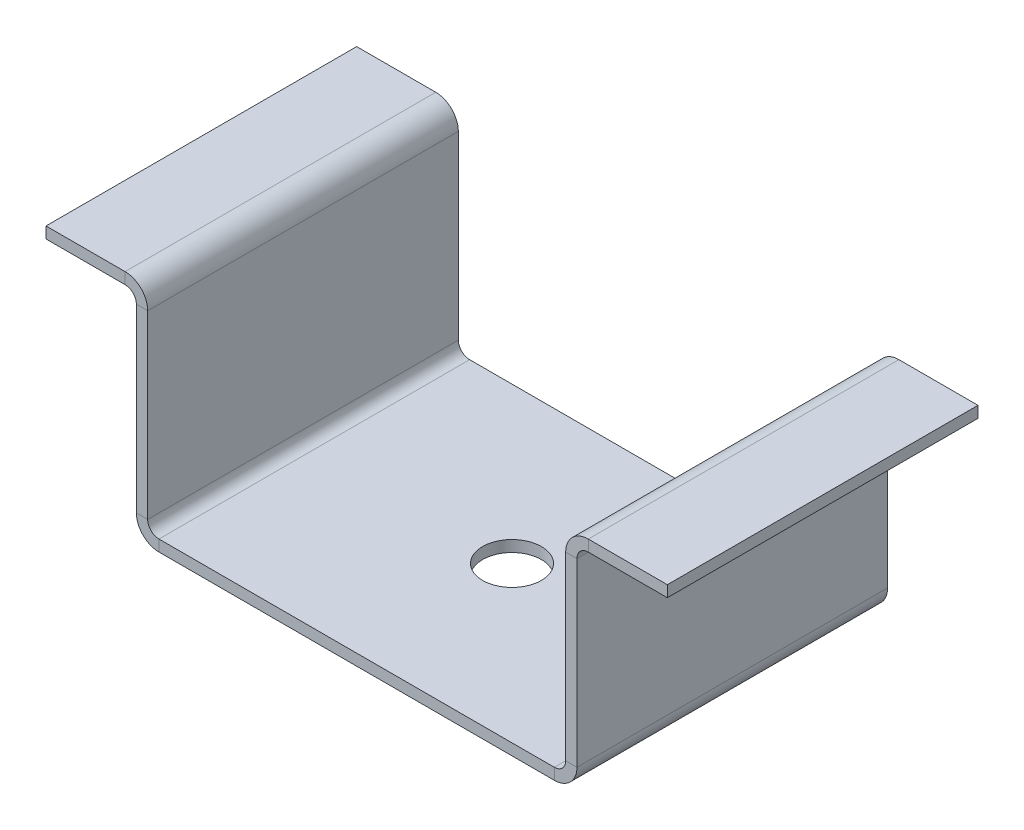
ISO-10303-21;
HEADER;
FILE_DESCRIPTION(('STEP AP214'),'2;1');
FILE_NAME('part.step','',(''),(''),'','','');
FILE_SCHEMA(('AUTOMOTIVE_DESIGN { 1 0 10303 214 1 1 1 1 }'));
ENDSEC;
DATA;
#1=APPLICATION_CONTEXT('core data for automotive mechanical design processes');
#2=APPLICATION_PROTOCOL_DEFINITION('international standard','automotive_design',2000,#1);
#3=PRODUCT_CONTEXT('',#1,'mechanical');
#4=PRODUCT('Part','Part','',(#3));
#5=PRODUCT_RELATED_PRODUCT_CATEGORY('part','',(#4));
#6=PRODUCT_DEFINITION_FORMATION('','',#4);
#7=PRODUCT_DEFINITION_CONTEXT('part definition',#1,'design');
#8=PRODUCT_DEFINITION('design','',#6,#7);
#9=PRODUCT_DEFINITION_SHAPE('','',#8);
#10=(LENGTH_UNIT() NAMED_UNIT(*) SI_UNIT(.MILLI.,.METRE.));
#11=(NAMED_UNIT(*) PLANE_ANGLE_UNIT() SI_UNIT($,.RADIAN.));
#12=(NAMED_UNIT(*) SI_UNIT($,.STERADIAN.) SOLID_ANGLE_UNIT());
#13=UNCERTAINTY_MEASURE_WITH_UNIT(LENGTH_MEASURE(1.E-05),#10,'distance_accuracy_value','');
#14=(GEOMETRIC_REPRESENTATION_CONTEXT(3) GLOBAL_UNCERTAINTY_ASSIGNED_CONTEXT((#13)) GLOBAL_UNIT_ASSIGNED_CONTEXT((#10,
#11,#12)) REPRESENTATION_CONTEXT('',''));
#15=CARTESIAN_POINT('',(0.,0.,0.));
#16=DIRECTION('',(0.,0.,1.));
#17=DIRECTION('',(1.,0.,0.));
#18=AXIS2_PLACEMENT_3D('',#15,#16,#17);
#19=CARTESIAN_POINT('',(-39.0000000000001,40.,27.5));
#20=DIRECTION('',(0.,0.,-1.));
#21=DIRECTION('',(-1.,0.,0.));
#22=AXIS2_PLACEMENT_3D('',#19,#20,#21);
#23=PLANE('',#22);
#24=DIRECTION('',(1.,0.,0.));
#25=VECTOR('',#24,1.);
#26=CARTESIAN_POINT('',(-39.0000000000001,36.,27.5));
#27=LINE('',#26,#25);
#28=CARTESIAN_POINT('',(-39.0000000000001,36.,27.5));
#29=VERTEX_POINT('',#28);
#30=CARTESIAN_POINT('',(-37.0000000000001,36.,27.5));
#31=VERTEX_POINT('',#30);
#32=EDGE_CURVE('E321',#29,#31,#27,.T.);
#33=ORIENTED_EDGE('',*,*,#32,.F.);
#34=DIRECTION('',(0.,1.,0.));
#35=VECTOR('',#34,1.);
#36=CARTESIAN_POINT('',(-39.,-1.42291393803877E-13,27.5));
#37=LINE('',#36,#35);
#38=CARTESIAN_POINT('',(-39.,3.99999999999999,27.5));
#39=VERTEX_POINT('',#38);
#40=EDGE_CURVE('E423',#39,#29,#37,.T.);
#41=ORIENTED_EDGE('',*,*,#40,.F.);
#42=DIRECTION('',(1.,0.,0.));
#43=VECTOR('',#42,1.);
#44=CARTESIAN_POINT('',(-37.,4.,27.5));
#45=LINE('',#44,#43);
#46=CARTESIAN_POINT('',(-37.,4.,27.5));
#47=VERTEX_POINT('',#46);
#48=EDGE_CURVE('E434',#47,#39,#45,.F.);
#49=ORIENTED_EDGE('',*,*,#48,.F.);
#50=DIRECTION('',(0.,-1.,0.));
#51=VECTOR('',#50,1.);
#52=CARTESIAN_POINT('',(-37.0000000000001,40.,27.5));
#53=LINE('',#52,#51);
#54=EDGE_CURVE('E428',#47,#31,#53,.F.);
#55=ORIENTED_EDGE('',*,*,#54,.T.);
#56=EDGE_LOOP('',(#33,#41,#49,#55));
#57=FACE_BOUND('',#56,.T.);
#58=ADVANCED_FACE('F124',(#57),#23,.F.);
#59=CARTESIAN_POINT('',(-39.,1.99999999999999,-27.5));
#60=DIRECTION('',(0.,0.,1.));
#61=DIRECTION('',(1.,0.,0.));
#62=AXIS2_PLACEMENT_3D('',#59,#60,#61);
#63=PLANE('',#62);
#64=DIRECTION('',(1.,0.,0.));
#65=VECTOR('',#64,1.);
#66=CARTESIAN_POINT('',(-39.0000000000001,36.,-27.5));
#67=LINE('',#66,#65);
#68=CARTESIAN_POINT('',(-39.0000000000001,36.,-27.5));
#69=VERTEX_POINT('',#68);
#70=CARTESIAN_POINT('',(-37.0000000000001,36.,-27.5));
#71=VERTEX_POINT('',#70);
#72=EDGE_CURVE('E310',#69,#71,#67,.T.);
#73=ORIENTED_EDGE('',*,*,#72,.T.);
#74=DIRECTION('',(0.,1.,0.));
#75=VECTOR('',#74,1.);
#76=CARTESIAN_POINT('',(-37.,2.,-27.5));
#77=LINE('',#76,#75);
#78=CARTESIAN_POINT('',(-37.,4.,-27.5));
#79=VERTEX_POINT('',#78);
#80=EDGE_CURVE('E426',#71,#79,#77,.F.);
#81=ORIENTED_EDGE('',*,*,#80,.T.);
#82=DIRECTION('',(1.,0.,0.));
#83=VECTOR('',#82,1.);
#84=CARTESIAN_POINT('',(-39.,3.99999999999999,-27.5));
#85=LINE('',#84,#83);
#86=CARTESIAN_POINT('',(-39.,3.99999999999999,-27.5));
#87=VERTEX_POINT('',#86);
#88=EDGE_CURVE('E417',#79,#87,#85,.F.);
#89=ORIENTED_EDGE('',*,*,#88,.T.);
#90=DIRECTION('',(0.,-1.,0.));
#91=VECTOR('',#90,1.);
#92=CARTESIAN_POINT('',(-39.,-1.42291393803877E-13,-27.5));
#93=LINE('',#92,#91);
#94=EDGE_CURVE('E420',#69,#87,#93,.T.);
#95=ORIENTED_EDGE('',*,*,#94,.F.);
#96=EDGE_LOOP('',(#73,#81,#89,#95));
#97=FACE_BOUND('',#96,.T.);
#98=ADVANCED_FACE('F544',(#97),#63,.F.);
#99=CARTESIAN_POINT('',(-39.,-1.42291393803877E-13,0.));
#100=DIRECTION('',(1.,0.,0.));
#101=DIRECTION('',(0.,1.,0.));
#102=AXIS2_PLACEMENT_3D('',#99,#100,#101);
#103=PLANE('',#102);
#104=DIRECTION('',(0.,0.,-1.));
#105=VECTOR('',#104,1.);
#106=CARTESIAN_POINT('',(-39.0000000000001,36.,-27.5));
#107=LINE('',#106,#105);
#108=EDGE_CURVE('E316',#69,#29,#107,.F.);
#109=ORIENTED_EDGE('',*,*,#108,.F.);
#110=ORIENTED_EDGE('',*,*,#94,.T.);
#111=DIRECTION('',(0.,0.,1.));
#112=VECTOR('',#111,1.);
#113=CARTESIAN_POINT('',(-39.,3.99999999999999,-27.5));
#114=LINE('',#113,#112);
#115=EDGE_CURVE('E431',#39,#87,#114,.F.);
#116=ORIENTED_EDGE('',*,*,#115,.F.);
#117=ORIENTED_EDGE('',*,*,#40,.T.);
#118=EDGE_LOOP('',(#109,#110,#116,#117));
#119=FACE_BOUND('',#118,.T.);
#120=ADVANCED_FACE('F550',(#119),#103,.F.);
#121=CARTESIAN_POINT('',(-37.,-1.35308431126191E-13,0.));
#122=DIRECTION('',(1.,0.,0.));
#123=DIRECTION('',(0.,1.,0.));
#124=AXIS2_PLACEMENT_3D('',#121,#122,#123);
#125=PLANE('',#124);
#126=ORIENTED_EDGE('',*,*,#80,.F.);
#127=DIRECTION('',(0.,0.,-1.));
#128=VECTOR('',#127,1.);
#129=CARTESIAN_POINT('',(-37.0000000000001,36.,-27.5));
#130=LINE('',#129,#128);
#131=EDGE_CURVE('E305',#71,#31,#130,.F.);
#132=ORIENTED_EDGE('',*,*,#131,.T.);
#133=ORIENTED_EDGE('',*,*,#54,.F.);
#134=DIRECTION('',(0.,0.,1.));
#135=VECTOR('',#134,1.);
#136=CARTESIAN_POINT('',(-37.,4.,-27.5));
#137=LINE('',#136,#135);
#138=EDGE_CURVE('E437',#79,#47,#137,.T.);
#139=ORIENTED_EDGE('',*,*,#138,.F.);
#140=EDGE_LOOP('',(#126,#132,#133,#139));
#141=FACE_BOUND('',#140,.T.);
#142=ADVANCED_FACE('F598',(#141),#125,.T.);
#143=CARTESIAN_POINT('',(39.,1.99999999999999,27.5));
#144=DIRECTION('',(0.,0.,-1.));
#145=DIRECTION('',(-1.,0.,0.));
#146=AXIS2_PLACEMENT_3D('',#143,#144,#145);
#147=PLANE('',#146);
#148=DIRECTION('',(-1.,0.,0.));
#149=VECTOR('',#148,1.);
#150=CARTESIAN_POINT('',(39.0000000000001,36.,27.5));
#151=LINE('',#150,#149);
#152=CARTESIAN_POINT('',(39.0000000000001,36.,27.5));
#153=VERTEX_POINT('',#152);
#154=CARTESIAN_POINT('',(37.0000000000001,36.,27.5));
#155=VERTEX_POINT('',#154);
#156=EDGE_CURVE('E361',#153,#155,#151,.T.);
#157=ORIENTED_EDGE('',*,*,#156,.T.);
#158=DIRECTION('',(0.,1.,0.));
#159=VECTOR('',#158,1.);
#160=CARTESIAN_POINT('',(37.,2.,27.5));
#161=LINE('',#160,#159);
#162=CARTESIAN_POINT('',(37.,4.,27.5));
#163=VERTEX_POINT('',#162);
#164=EDGE_CURVE('E385',#155,#163,#161,.F.);
#165=ORIENTED_EDGE('',*,*,#164,.T.);
#166=DIRECTION('',(-1.,0.,0.));
#167=VECTOR('',#166,1.);
#168=CARTESIAN_POINT('',(39.,3.99999999999999,27.5));
#169=LINE('',#168,#167);
#170=CARTESIAN_POINT('',(39.,3.99999999999999,27.5));
#171=VERTEX_POINT('',#170);
#172=EDGE_CURVE('E373',#163,#171,#169,.F.);
#173=ORIENTED_EDGE('',*,*,#172,.T.);
#174=DIRECTION('',(0.,-1.,0.));
#175=VECTOR('',#174,1.);
#176=CARTESIAN_POINT('',(39.,-1.42291393803877E-13,27.5));
#177=LINE('',#176,#175);
#178=EDGE_CURVE('E380',#153,#171,#177,.T.);
#179=ORIENTED_EDGE('',*,*,#178,.F.);
#180=EDGE_LOOP('',(#157,#165,#173,#179));
#181=FACE_BOUND('',#180,.T.);
#182=ADVANCED_FACE('F502',(#181),#147,.F.);
#183=CARTESIAN_POINT('',(39.0000000000001,40.,-27.5));
#184=DIRECTION('',(0.,0.,1.));
#185=DIRECTION('',(1.,0.,0.));
#186=AXIS2_PLACEMENT_3D('',#183,#184,#185);
#187=PLANE('',#186);
#188=DIRECTION('',(-1.,0.,0.));
#189=VECTOR('',#188,1.);
#190=CARTESIAN_POINT('',(39.0000000000001,36.,-27.5));
#191=LINE('',#190,#189);
#192=CARTESIAN_POINT('',(39.0000000000001,36.,-27.5));
#193=VERTEX_POINT('',#192);
#194=CARTESIAN_POINT('',(37.0000000000001,36.,-27.5));
#195=VERTEX_POINT('',#194);
#196=EDGE_CURVE('E371',#193,#195,#191,.T.);
#197=ORIENTED_EDGE('',*,*,#196,.F.);
#198=DIRECTION('',(0.,1.,0.));
#199=VECTOR('',#198,1.);
#200=CARTESIAN_POINT('',(39.,-1.42291393803877E-13,-27.5));
#201=LINE('',#200,#199);
#202=CARTESIAN_POINT('',(39.,3.99999999999999,-27.5));
#203=VERTEX_POINT('',#202);
#204=EDGE_CURVE('E376',#203,#193,#201,.T.);
#205=ORIENTED_EDGE('',*,*,#204,.F.);
#206=DIRECTION('',(-1.,0.,0.));
#207=VECTOR('',#206,1.);
#208=CARTESIAN_POINT('',(37.,4.,-27.5));
#209=LINE('',#208,#207);
#210=CARTESIAN_POINT('',(37.,4.,-27.5));
#211=VERTEX_POINT('',#210);
#212=EDGE_CURVE('E390',#211,#203,#209,.F.);
#213=ORIENTED_EDGE('',*,*,#212,.F.);
#214=DIRECTION('',(0.,-1.,0.));
#215=VECTOR('',#214,1.);
#216=CARTESIAN_POINT('',(37.0000000000001,40.,-27.5));
#217=LINE('',#216,#215);
#218=EDGE_CURVE('E382',#211,#195,#217,.F.);
#219=ORIENTED_EDGE('',*,*,#218,.T.);
#220=EDGE_LOOP('',(#197,#205,#213,#219));
#221=FACE_BOUND('',#220,.T.);
#222=ADVANCED_FACE('F488',(#221),#187,.F.);
#223=CARTESIAN_POINT('',(39.,-1.42291393803877E-13,0.));
#224=DIRECTION('',(-1.,0.,0.));
#225=DIRECTION('',(0.,-1.,0.));
#226=AXIS2_PLACEMENT_3D('',#223,#224,#225);
#227=PLANE('',#226);
#228=DIRECTION('',(0.,0.,1.));
#229=VECTOR('',#228,1.);
#230=CARTESIAN_POINT('',(39.0000000000001,36.,27.5));
#231=LINE('',#230,#229);
#232=EDGE_CURVE('E367',#153,#193,#231,.F.);
#233=ORIENTED_EDGE('',*,*,#232,.F.);
#234=ORIENTED_EDGE('',*,*,#178,.T.);
#235=DIRECTION('',(0.,0.,-1.));
#236=VECTOR('',#235,1.);
#237=CARTESIAN_POINT('',(39.,3.99999999999999,27.5));
#238=LINE('',#237,#236);
#239=EDGE_CURVE('E387',#203,#171,#238,.F.);
#240=ORIENTED_EDGE('',*,*,#239,.F.);
#241=ORIENTED_EDGE('',*,*,#204,.T.);
#242=EDGE_LOOP('',(#233,#234,#240,#241));
#243=FACE_BOUND('',#242,.T.);
#244=ADVANCED_FACE('F493',(#243),#227,.F.);
#245=CARTESIAN_POINT('',(37.,-1.35308431126191E-13,0.));
#246=DIRECTION('',(-1.,0.,0.));
#247=DIRECTION('',(0.,-1.,0.));
#248=AXIS2_PLACEMENT_3D('',#245,#246,#247);
#249=PLANE('',#248);
#250=ORIENTED_EDGE('',*,*,#164,.F.);
#251=DIRECTION('',(0.,0.,1.));
#252=VECTOR('',#251,1.);
#253=CARTESIAN_POINT('',(37.0000000000001,36.,27.5));
#254=LINE('',#253,#252);
#255=EDGE_CURVE('E356',#155,#195,#254,.F.);
#256=ORIENTED_EDGE('',*,*,#255,.T.);
#257=ORIENTED_EDGE('',*,*,#218,.F.);
#258=DIRECTION('',(0.,0.,-1.));
#259=VECTOR('',#258,1.);
#260=CARTESIAN_POINT('',(37.,4.,27.5));
#261=LINE('',#260,#259);
#262=EDGE_CURVE('E393',#163,#211,#261,.T.);
#263=ORIENTED_EDGE('',*,*,#262,.F.);
#264=EDGE_LOOP('',(#250,#256,#257,#263));
#265=FACE_BOUND('',#264,.T.);
#266=ADVANCED_FACE('F485',(#265),#249,.T.);
#267=CARTESIAN_POINT('',(-39.,0.,27.5));
#268=DIRECTION('',(0.,1.,0.));
#269=DIRECTION('',(0.,0.,1.));
#270=AXIS2_PLACEMENT_3D('',#267,#268,#269);
#271=PLANE('',#270);
#272=CARTESIAN_POINT('',(0.,0.,0.));
#273=DIRECTION('',(0.,1.,0.));
#274=DIRECTION('',(0.,0.,1.));
#275=AXIS2_PLACEMENT_3D('',#272,#273,#274);
#276=CIRCLE('',#275,5.2);
#277=CARTESIAN_POINT('',(0.,0.,5.2));
#278=VERTEX_POINT('',#277);
#279=EDGE_CURVE('E304',#278,#278,#276,.T.);
#280=ORIENTED_EDGE('',*,*,#279,.T.);
#281=EDGE_LOOP('',(#280));
#282=FACE_BOUND('',#281,.T.);
#283=DIRECTION('',(0.,0.,-1.));
#284=VECTOR('',#283,1.);
#285=CARTESIAN_POINT('',(35.,0.,-27.5));
#286=LINE('',#285,#284);
#287=CARTESIAN_POINT('',(35.,0.,-27.5));
#288=VERTEX_POINT('',#287);
#289=CARTESIAN_POINT('',(35.,0.,27.5));
#290=VERTEX_POINT('',#289);
#291=EDGE_CURVE('E397',#288,#290,#286,.F.);
#292=ORIENTED_EDGE('',*,*,#291,.T.);
#293=DIRECTION('',(1.,0.,0.));
#294=VECTOR('',#293,1.);
#295=CARTESIAN_POINT('',(-39.,0.,27.5));
#296=LINE('',#295,#294);
#297=CARTESIAN_POINT('',(-35.,0.,27.5));
#298=VERTEX_POINT('',#297);
#299=EDGE_CURVE('E133',#298,#290,#296,.T.);
#300=ORIENTED_EDGE('',*,*,#299,.F.);
#301=DIRECTION('',(0.,0.,1.));
#302=VECTOR('',#301,1.);
#303=CARTESIAN_POINT('',(-35.,0.,27.5));
#304=LINE('',#303,#302);
#305=CARTESIAN_POINT('',(-35.,0.,-27.5));
#306=VERTEX_POINT('',#305);
#307=EDGE_CURVE('E441',#298,#306,#304,.F.);
#308=ORIENTED_EDGE('',*,*,#307,.T.);
#309=DIRECTION('',(1.,0.,0.));
#310=VECTOR('',#309,1.);
#311=CARTESIAN_POINT('',(-39.,0.,-27.5));
#312=LINE('',#311,#310);
#313=EDGE_CURVE('E462',#306,#288,#312,.T.);
#314=ORIENTED_EDGE('',*,*,#313,.T.);
#315=EDGE_LOOP('',(#292,#300,#308,#314));
#316=FACE_BOUND('',#315,.T.);
#317=ADVANCED_FACE('F126',(#282,#316),#271,.F.);
#318=CARTESIAN_POINT('',(-39.,2.,27.5));
#319=DIRECTION('',(0.,1.,0.));
#320=DIRECTION('',(0.,0.,1.));
#321=AXIS2_PLACEMENT_3D('',#318,#319,#320);
#322=PLANE('',#321);
#323=CARTESIAN_POINT('',(0.,2.,0.));
#324=DIRECTION('',(0.,1.,0.));
#325=DIRECTION('',(0.,0.,1.));
#326=AXIS2_PLACEMENT_3D('',#323,#324,#325);
#327=CIRCLE('',#326,5.2);
#328=CARTESIAN_POINT('',(0.,2.,5.2));
#329=VERTEX_POINT('',#328);
#330=EDGE_CURVE('E587',#329,#329,#327,.T.);
#331=ORIENTED_EDGE('',*,*,#330,.F.);
#332=EDGE_LOOP('',(#331));
#333=FACE_BOUND('',#332,.T.);
#334=DIRECTION('',(1.,0.,0.));
#335=VECTOR('',#334,1.);
#336=CARTESIAN_POINT('',(-39.,2.,27.5));
#337=LINE('',#336,#335);
#338=CARTESIAN_POINT('',(-35.,2.,27.5));
#339=VERTEX_POINT('',#338);
#340=CARTESIAN_POINT('',(35.,2.,27.5));
#341=VERTEX_POINT('',#340);
#342=EDGE_CURVE('E13',#339,#341,#337,.T.);
#343=ORIENTED_EDGE('',*,*,#342,.T.);
#344=DIRECTION('',(0.,0.,-1.));
#345=VECTOR('',#344,1.);
#346=CARTESIAN_POINT('',(35.,2.,-27.5));
#347=LINE('',#346,#345);
#348=CARTESIAN_POINT('',(35.,2.,-27.5));
#349=VERTEX_POINT('',#348);
#350=EDGE_CURVE('E409',#349,#341,#347,.F.);
#351=ORIENTED_EDGE('',*,*,#350,.F.);
#352=DIRECTION('',(1.,0.,0.));
#353=VECTOR('',#352,1.);
#354=CARTESIAN_POINT('',(-39.,2.,-27.5));
#355=LINE('',#354,#353);
#356=CARTESIAN_POINT('',(-35.,2.,-27.5));
#357=VERTEX_POINT('',#356);
#358=EDGE_CURVE('E128',#357,#349,#355,.T.);
#359=ORIENTED_EDGE('',*,*,#358,.F.);
#360=DIRECTION('',(0.,0.,1.));
#361=VECTOR('',#360,1.);
#362=CARTESIAN_POINT('',(-35.,2.,27.5));
#363=LINE('',#362,#361);
#364=EDGE_CURVE('E454',#339,#357,#363,.F.);
#365=ORIENTED_EDGE('',*,*,#364,.F.);
#366=EDGE_LOOP('',(#343,#351,#359,#365));
#367=FACE_BOUND('',#366,.T.);
#368=ADVANCED_FACE('F575',(#333,#367),#322,.T.);
#369=CARTESIAN_POINT('',(0.,0.,27.5));
#370=DIRECTION('',(0.,0.,-1.));
#371=DIRECTION('',(-1.,0.,0.));
#372=AXIS2_PLACEMENT_3D('',#369,#370,#371);
#373=PLANE('',#372);
#374=DIRECTION('',(0.,-1.,0.));
#375=VECTOR('',#374,1.);
#376=CARTESIAN_POINT('',(35.,2.,27.5));
#377=LINE('',#376,#375);
#378=EDGE_CURVE('E414',#341,#290,#377,.T.);
#379=ORIENTED_EDGE('',*,*,#378,.F.);
#380=ORIENTED_EDGE('',*,*,#342,.F.);
#381=DIRECTION('',(0.,-1.,0.));
#382=VECTOR('',#381,1.);
#383=CARTESIAN_POINT('',(-35.,2.,27.5));
#384=LINE('',#383,#382);
#385=EDGE_CURVE('E448',#339,#298,#384,.T.);
#386=ORIENTED_EDGE('',*,*,#385,.T.);
#387=ORIENTED_EDGE('',*,*,#299,.T.);
#388=EDGE_LOOP('',(#379,#380,#386,#387));
#389=FACE_BOUND('',#388,.T.);
#390=ADVANCED_FACE('F572',(#389),#373,.F.);
#391=CARTESIAN_POINT('',(0.,0.,-27.5));
#392=DIRECTION('',(0.,0.,-1.));
#393=DIRECTION('',(-1.,0.,0.));
#394=AXIS2_PLACEMENT_3D('',#391,#392,#393);
#395=PLANE('',#394);
#396=ORIENTED_EDGE('',*,*,#358,.T.);
#397=DIRECTION('',(0.,-1.,0.));
#398=VECTOR('',#397,1.);
#399=CARTESIAN_POINT('',(35.,2.,-27.5));
#400=LINE('',#399,#398);
#401=EDGE_CURVE('E403',#349,#288,#400,.T.);
#402=ORIENTED_EDGE('',*,*,#401,.T.);
#403=ORIENTED_EDGE('',*,*,#313,.F.);
#404=DIRECTION('',(0.,-1.,0.));
#405=VECTOR('',#404,1.);
#406=CARTESIAN_POINT('',(-35.,2.,-27.5));
#407=LINE('',#406,#405);
#408=EDGE_CURVE('E459',#357,#306,#407,.T.);
#409=ORIENTED_EDGE('',*,*,#408,.F.);
#410=EDGE_LOOP('',(#396,#402,#403,#409));
#411=FACE_BOUND('',#410,.T.);
#412=ADVANCED_FACE('F471',(#411),#395,.T.);
#413=CARTESIAN_POINT('',(-35.,4.,-27.5));
#414=DIRECTION('',(0.,0.,-1.));
#415=DIRECTION('',(-1.,0.,0.));
#416=AXIS2_PLACEMENT_3D('',#413,#414,#415);
#417=PLANE('',#416);
#418=ORIENTED_EDGE('',*,*,#88,.F.);
#419=CARTESIAN_POINT('',(-35.,4.,-27.5));
#420=DIRECTION('',(0.,0.,1.));
#421=DIRECTION('',(1.,0.,0.));
#422=AXIS2_PLACEMENT_3D('',#419,#420,#421);
#423=CIRCLE('',#422,2.);
#424=EDGE_CURVE('E451',#357,#79,#423,.F.);
#425=ORIENTED_EDGE('',*,*,#424,.F.);
#426=ORIENTED_EDGE('',*,*,#408,.T.);
#427=CARTESIAN_POINT('',(-35.,4.,-27.5));
#428=DIRECTION('',(0.,0.,1.));
#429=DIRECTION('',(1.,0.,0.));
#430=AXIS2_PLACEMENT_3D('',#427,#428,#429);
#431=CIRCLE('',#430,4.);
#432=EDGE_CURVE('E444',#306,#87,#431,.F.);
#433=ORIENTED_EDGE('',*,*,#432,.T.);
#434=EDGE_LOOP('',(#418,#425,#426,#433));
#435=FACE_BOUND('',#434,.T.);
#436=ADVANCED_FACE('F565',(#435),#417,.T.);
#437=CARTESIAN_POINT('',(-35.,4.,27.5));
#438=DIRECTION('',(0.,0.,-1.));
#439=DIRECTION('',(-1.,0.,0.));
#440=AXIS2_PLACEMENT_3D('',#437,#438,#439);
#441=PLANE('',#440);
#442=CARTESIAN_POINT('',(-35.,4.,27.5));
#443=DIRECTION('',(0.,0.,1.));
#444=DIRECTION('',(1.,0.,0.));
#445=AXIS2_PLACEMENT_3D('',#442,#443,#444);
#446=CIRCLE('',#445,2.);
#447=EDGE_CURVE('E422',#47,#339,#446,.T.);
#448=ORIENTED_EDGE('',*,*,#447,.F.);
#449=ORIENTED_EDGE('',*,*,#48,.T.);
#450=CARTESIAN_POINT('',(-35.,4.,27.5));
#451=DIRECTION('',(0.,0.,1.));
#452=DIRECTION('',(1.,0.,0.));
#453=AXIS2_PLACEMENT_3D('',#450,#451,#452);
#454=CIRCLE('',#453,4.);
#455=EDGE_CURVE('E445',#39,#298,#454,.T.);
#456=ORIENTED_EDGE('',*,*,#455,.T.);
#457=ORIENTED_EDGE('',*,*,#385,.F.);
#458=EDGE_LOOP('',(#448,#449,#456,#457));
#459=FACE_BOUND('',#458,.T.);
#460=ADVANCED_FACE('F560',(#459),#441,.F.);
#461=CARTESIAN_POINT('',(-35.,4.,27.5));
#462=DIRECTION('',(0.,0.,1.));
#463=DIRECTION('',(-1.,0.,0.));
#464=AXIS2_PLACEMENT_3D('',#461,#462,#463);
#465=CYLINDRICAL_SURFACE('',#464,4.);
#466=ORIENTED_EDGE('',*,*,#307,.F.);
#467=ORIENTED_EDGE('',*,*,#455,.F.);
#468=ORIENTED_EDGE('',*,*,#115,.T.);
#469=ORIENTED_EDGE('',*,*,#432,.F.);
#470=EDGE_LOOP('',(#466,#467,#468,#469));
#471=FACE_BOUND('',#470,.T.);
#472=ADVANCED_FACE('F556',(#471),#465,.T.);
#473=CARTESIAN_POINT('',(-35.,4.,27.5));
#474=DIRECTION('',(0.,0.,1.));
#475=DIRECTION('',(-1.,0.,0.));
#476=AXIS2_PLACEMENT_3D('',#473,#474,#475);
#477=CYLINDRICAL_SURFACE('',#476,2.);
#478=ORIENTED_EDGE('',*,*,#364,.T.);
#479=ORIENTED_EDGE('',*,*,#424,.T.);
#480=ORIENTED_EDGE('',*,*,#138,.T.);
#481=ORIENTED_EDGE('',*,*,#447,.T.);
#482=EDGE_LOOP('',(#478,#479,#480,#481));
#483=FACE_BOUND('',#482,.T.);
#484=ADVANCED_FACE('F559',(#483),#477,.F.);
#485=CARTESIAN_POINT('',(35.,4.,27.5));
#486=DIRECTION('',(0.,0.,1.));
#487=DIRECTION('',(1.,0.,0.));
#488=AXIS2_PLACEMENT_3D('',#485,#486,#487);
#489=PLANE('',#488);
#490=ORIENTED_EDGE('',*,*,#172,.F.);
#491=CARTESIAN_POINT('',(35.,4.,27.5));
#492=DIRECTION('',(0.,0.,-1.));
#493=DIRECTION('',(-1.,0.,0.));
#494=AXIS2_PLACEMENT_3D('',#491,#492,#493);
#495=CIRCLE('',#494,2.);
#496=EDGE_CURVE('E406',#341,#163,#495,.F.);
#497=ORIENTED_EDGE('',*,*,#496,.F.);
#498=ORIENTED_EDGE('',*,*,#378,.T.);
#499=CARTESIAN_POINT('',(35.,4.,27.5));
#500=DIRECTION('',(0.,0.,-1.));
#501=DIRECTION('',(-1.,0.,0.));
#502=AXIS2_PLACEMENT_3D('',#499,#500,#501);
#503=CIRCLE('',#502,4.);
#504=EDGE_CURVE('E399',#290,#171,#503,.F.);
#505=ORIENTED_EDGE('',*,*,#504,.T.);
#506=EDGE_LOOP('',(#490,#497,#498,#505));
#507=FACE_BOUND('',#506,.T.);
#508=ADVANCED_FACE('F500',(#507),#489,.T.);
#509=CARTESIAN_POINT('',(35.,4.,-27.5));
#510=DIRECTION('',(0.,0.,1.));
#511=DIRECTION('',(1.,0.,0.));
#512=AXIS2_PLACEMENT_3D('',#509,#510,#511);
#513=PLANE('',#512);
#514=CARTESIAN_POINT('',(35.,4.,-27.5));
#515=DIRECTION('',(0.,0.,-1.));
#516=DIRECTION('',(-1.,0.,0.));
#517=AXIS2_PLACEMENT_3D('',#514,#515,#516);
#518=CIRCLE('',#517,2.);
#519=EDGE_CURVE('E379',#211,#349,#518,.T.);
#520=ORIENTED_EDGE('',*,*,#519,.F.);
#521=ORIENTED_EDGE('',*,*,#212,.T.);
#522=CARTESIAN_POINT('',(35.,4.,-27.5));
#523=DIRECTION('',(0.,0.,-1.));
#524=DIRECTION('',(-1.,0.,0.));
#525=AXIS2_PLACEMENT_3D('',#522,#523,#524);
#526=CIRCLE('',#525,4.);
#527=EDGE_CURVE('E400',#203,#288,#526,.T.);
#528=ORIENTED_EDGE('',*,*,#527,.T.);
#529=ORIENTED_EDGE('',*,*,#401,.F.);
#530=EDGE_LOOP('',(#520,#521,#528,#529));
#531=FACE_BOUND('',#530,.T.);
#532=ADVANCED_FACE('F476',(#531),#513,.F.);
#533=CARTESIAN_POINT('',(35.,4.,-27.5));
#534=DIRECTION('',(0.,0.,-1.));
#535=DIRECTION('',(1.,0.,0.));
#536=AXIS2_PLACEMENT_3D('',#533,#534,#535);
#537=CYLINDRICAL_SURFACE('',#536,4.);
#538=ORIENTED_EDGE('',*,*,#291,.F.);
#539=ORIENTED_EDGE('',*,*,#527,.F.);
#540=ORIENTED_EDGE('',*,*,#239,.T.);
#541=ORIENTED_EDGE('',*,*,#504,.F.);
#542=EDGE_LOOP('',(#538,#539,#540,#541));
#543=FACE_BOUND('',#542,.T.);
#544=ADVANCED_FACE('F497',(#543),#537,.T.);
#545=CARTESIAN_POINT('',(35.,4.,-27.5));
#546=DIRECTION('',(0.,0.,-1.));
#547=DIRECTION('',(1.,0.,0.));
#548=AXIS2_PLACEMENT_3D('',#545,#546,#547);
#549=CYLINDRICAL_SURFACE('',#548,2.);
#550=ORIENTED_EDGE('',*,*,#350,.T.);
#551=ORIENTED_EDGE('',*,*,#496,.T.);
#552=ORIENTED_EDGE('',*,*,#262,.T.);
#553=ORIENTED_EDGE('',*,*,#519,.T.);
#554=EDGE_LOOP('',(#550,#551,#552,#553));
#555=FACE_BOUND('',#554,.T.);
#556=ADVANCED_FACE('F479',(#555),#549,.F.);
#557=CARTESIAN_POINT('',(41.0000000000001,36.,-27.5));
#558=DIRECTION('',(0.,0.,-1.));
#559=DIRECTION('',(-1.,0.,0.));
#560=AXIS2_PLACEMENT_3D('',#557,#558,#559);
#561=PLANE('',#560);
#562=DIRECTION('',(0.,-1.,0.));
#563=VECTOR('',#562,1.);
#564=CARTESIAN_POINT('',(41.0000000000001,40.,-27.5));
#565=LINE('',#564,#563);
#566=CARTESIAN_POINT('',(41.0000000000001,38.,-27.5));
#567=VERTEX_POINT('',#566);
#568=CARTESIAN_POINT('',(41.0000000000001,40.,-27.5));
#569=VERTEX_POINT('',#568);
#570=EDGE_CURVE('E323',#567,#569,#565,.F.);
#571=ORIENTED_EDGE('',*,*,#570,.F.);
#572=CARTESIAN_POINT('',(41.0000000000001,36.,-27.5));
#573=DIRECTION('',(0.,0.,1.));
#574=DIRECTION('',(1.,0.,0.));
#575=AXIS2_PLACEMENT_3D('',#572,#573,#574);
#576=CIRCLE('',#575,2.00000000000001);
#577=EDGE_CURVE('E364',#193,#567,#576,.F.);
#578=ORIENTED_EDGE('',*,*,#577,.F.);
#579=ORIENTED_EDGE('',*,*,#196,.T.);
#580=CARTESIAN_POINT('',(41.0000000000001,36.,-27.5));
#581=DIRECTION('',(0.,0.,1.));
#582=DIRECTION('',(1.,0.,0.));
#583=AXIS2_PLACEMENT_3D('',#580,#581,#582);
#584=CIRCLE('',#583,4.00000000000001);
#585=EDGE_CURVE('E149',#195,#569,#584,.F.);
#586=ORIENTED_EDGE('',*,*,#585,.T.);
#587=EDGE_LOOP('',(#571,#578,#579,#586));
#588=FACE_BOUND('',#587,.T.);
#589=ADVANCED_FACE('F532',(#588),#561,.T.);
#590=CARTESIAN_POINT('',(41.0000000000001,36.,27.5));
#591=DIRECTION('',(0.,0.,-1.));
#592=DIRECTION('',(-1.,0.,0.));
#593=AXIS2_PLACEMENT_3D('',#590,#591,#592);
#594=PLANE('',#593);
#595=CARTESIAN_POINT('',(41.0000000000001,36.,27.5));
#596=DIRECTION('',(0.,0.,1.));
#597=DIRECTION('',(1.,0.,0.));
#598=AXIS2_PLACEMENT_3D('',#595,#596,#597);
#599=CIRCLE('',#598,2.00000000000001);
#600=CARTESIAN_POINT('',(41.0000000000001,38.,27.5));
#601=VERTEX_POINT('',#600);
#602=EDGE_CURVE('E329',#601,#153,#599,.T.);
#603=ORIENTED_EDGE('',*,*,#602,.F.);
#604=DIRECTION('',(0.,-1.,0.));
#605=VECTOR('',#604,1.);
#606=CARTESIAN_POINT('',(41.0000000000001,38.,27.5));
#607=LINE('',#606,#605);
#608=CARTESIAN_POINT('',(41.0000000000001,40.,27.5));
#609=VERTEX_POINT('',#608);
#610=EDGE_CURVE('E349',#601,#609,#607,.F.);
#611=ORIENTED_EDGE('',*,*,#610,.T.);
#612=CARTESIAN_POINT('',(41.0000000000001,36.,27.5));
#613=DIRECTION('',(0.,0.,1.));
#614=DIRECTION('',(1.,0.,0.));
#615=AXIS2_PLACEMENT_3D('',#612,#613,#614);
#616=CIRCLE('',#615,4.00000000000001);
#617=EDGE_CURVE('E359',#609,#155,#616,.T.);
#618=ORIENTED_EDGE('',*,*,#617,.T.);
#619=ORIENTED_EDGE('',*,*,#156,.F.);
#620=EDGE_LOOP('',(#603,#611,#618,#619));
#621=FACE_BOUND('',#620,.T.);
#622=ADVANCED_FACE('F505',(#621),#594,.F.);
#623=CARTESIAN_POINT('',(41.0000000000001,36.,27.5));
#624=DIRECTION('',(0.,0.,1.));
#625=DIRECTION('',(0.,1.,0.));
#626=AXIS2_PLACEMENT_3D('',#623,#624,#625);
#627=CYLINDRICAL_SURFACE('',#626,4.00000000000001);
#628=ORIENTED_EDGE('',*,*,#255,.F.);
#629=ORIENTED_EDGE('',*,*,#617,.F.);
#630=DIRECTION('',(0.,0.,1.));
#631=VECTOR('',#630,1.);
#632=CARTESIAN_POINT('',(41.0000000000001,40.,-27.5));
#633=LINE('',#632,#631);
#634=EDGE_CURVE('E347',#609,#569,#633,.F.);
#635=ORIENTED_EDGE('',*,*,#634,.T.);
#636=ORIENTED_EDGE('',*,*,#585,.F.);
#637=EDGE_LOOP('',(#628,#629,#635,#636));
#638=FACE_BOUND('',#637,.T.);
#639=ADVANCED_FACE('F530',(#638),#627,.T.);
#640=CARTESIAN_POINT('',(41.0000000000001,36.,27.5));
#641=DIRECTION('',(0.,0.,1.));
#642=DIRECTION('',(0.,1.,0.));
#643=AXIS2_PLACEMENT_3D('',#640,#641,#642);
#644=CYLINDRICAL_SURFACE('',#643,2.00000000000001);
#645=ORIENTED_EDGE('',*,*,#232,.T.);
#646=ORIENTED_EDGE('',*,*,#577,.T.);
#647=DIRECTION('',(0.,0.,1.));
#648=VECTOR('',#647,1.);
#649=CARTESIAN_POINT('',(41.0000000000001,38.,-27.5));
#650=LINE('',#649,#648);
#651=EDGE_CURVE('E352',#567,#601,#650,.T.);
#652=ORIENTED_EDGE('',*,*,#651,.T.);
#653=ORIENTED_EDGE('',*,*,#602,.T.);
#654=EDGE_LOOP('',(#645,#646,#652,#653));
#655=FACE_BOUND('',#654,.T.);
#656=ADVANCED_FACE('F508',(#655),#644,.F.);
#657=CARTESIAN_POINT('',(55.0000000000001,40.,27.5));
#658=DIRECTION('',(0.,0.,-1.));
#659=DIRECTION('',(-1.,0.,0.));
#660=AXIS2_PLACEMENT_3D('',#657,#658,#659);
#661=PLANE('',#660);
#662=ORIENTED_EDGE('',*,*,#610,.F.);
#663=DIRECTION('',(-1.,0.,0.));
#664=VECTOR('',#663,1.);
#665=CARTESIAN_POINT('',(55.0000000000001,38.,27.5));
#666=LINE('',#665,#664);
#667=CARTESIAN_POINT('',(55.0000000000001,38.,27.5));
#668=VERTEX_POINT('',#667);
#669=EDGE_CURVE('E345',#601,#668,#666,.F.);
#670=ORIENTED_EDGE('',*,*,#669,.T.);
#671=DIRECTION('',(0.,-1.,0.));
#672=VECTOR('',#671,1.);
#673=CARTESIAN_POINT('',(55.0000000000001,40.,27.5));
#674=LINE('',#673,#672);
#675=CARTESIAN_POINT('',(55.0000000000001,40.,27.5));
#676=VERTEX_POINT('',#675);
#677=EDGE_CURVE('E326',#676,#668,#674,.T.);
#678=ORIENTED_EDGE('',*,*,#677,.F.);
#679=DIRECTION('',(1.,0.,0.));
#680=VECTOR('',#679,1.);
#681=CARTESIAN_POINT('',(0.,40.,27.5));
#682=LINE('',#681,#680);
#683=EDGE_CURVE('E338',#609,#676,#682,.T.);
#684=ORIENTED_EDGE('',*,*,#683,.F.);
#685=EDGE_LOOP('',(#662,#670,#678,#684));
#686=FACE_BOUND('',#685,.T.);
#687=ADVANCED_FACE('F526',(#686),#661,.F.);
#688=CARTESIAN_POINT('',(39.0000000000001,40.,-27.5));
#689=DIRECTION('',(0.,0.,1.));
#690=DIRECTION('',(1.,0.,0.));
#691=AXIS2_PLACEMENT_3D('',#688,#689,#690);
#692=PLANE('',#691);
#693=ORIENTED_EDGE('',*,*,#570,.T.);
#694=DIRECTION('',(-1.,0.,0.));
#695=VECTOR('',#694,1.);
#696=CARTESIAN_POINT('',(0.,40.,-27.5));
#697=LINE('',#696,#695);
#698=CARTESIAN_POINT('',(55.0000000000001,40.,-27.5));
#699=VERTEX_POINT('',#698);
#700=EDGE_CURVE('E333',#699,#569,#697,.T.);
#701=ORIENTED_EDGE('',*,*,#700,.F.);
#702=DIRECTION('',(0.,-1.,0.));
#703=VECTOR('',#702,1.);
#704=CARTESIAN_POINT('',(55.0000000000001,40.,-27.5));
#705=LINE('',#704,#703);
#706=CARTESIAN_POINT('',(55.0000000000001,38.,-27.5));
#707=VERTEX_POINT('',#706);
#708=EDGE_CURVE('E330',#699,#707,#705,.T.);
#709=ORIENTED_EDGE('',*,*,#708,.T.);
#710=DIRECTION('',(1.,0.,0.));
#711=VECTOR('',#710,1.);
#712=CARTESIAN_POINT('',(39.0000000000001,38.,-27.5));
#713=LINE('',#712,#711);
#714=EDGE_CURVE('E340',#707,#567,#713,.F.);
#715=ORIENTED_EDGE('',*,*,#714,.T.);
#716=EDGE_LOOP('',(#693,#701,#709,#715));
#717=FACE_BOUND('',#716,.T.);
#718=ADVANCED_FACE('F517',(#717),#692,.F.);
#719=CARTESIAN_POINT('',(0.,40.,0.));
#720=DIRECTION('',(0.,-1.,0.));
#721=DIRECTION('',(0.,0.,-1.));
#722=AXIS2_PLACEMENT_3D('',#719,#720,#721);
#723=PLANE('',#722);
#724=ORIENTED_EDGE('',*,*,#634,.F.);
#725=ORIENTED_EDGE('',*,*,#683,.T.);
#726=DIRECTION('',(0.,0.,-1.));
#727=VECTOR('',#726,1.);
#728=CARTESIAN_POINT('',(55.0000000000001,40.,0.));
#729=LINE('',#728,#727);
#730=EDGE_CURVE('E336',#676,#699,#729,.T.);
#731=ORIENTED_EDGE('',*,*,#730,.T.);
#732=ORIENTED_EDGE('',*,*,#700,.T.);
#733=EDGE_LOOP('',(#724,#725,#731,#732));
#734=FACE_BOUND('',#733,.T.);
#735=ADVANCED_FACE('F529',(#734),#723,.F.);
#736=CARTESIAN_POINT('',(0.,38.,0.));
#737=DIRECTION('',(0.,-1.,0.));
#738=DIRECTION('',(0.,0.,-1.));
#739=AXIS2_PLACEMENT_3D('',#736,#737,#738);
#740=PLANE('',#739);
#741=ORIENTED_EDGE('',*,*,#669,.F.);
#742=ORIENTED_EDGE('',*,*,#651,.F.);
#743=ORIENTED_EDGE('',*,*,#714,.F.);
#744=DIRECTION('',(0.,0.,1.));
#745=VECTOR('',#744,1.);
#746=CARTESIAN_POINT('',(55.0000000000001,38.,-27.5));
#747=LINE('',#746,#745);
#748=EDGE_CURVE('E343',#668,#707,#747,.F.);
#749=ORIENTED_EDGE('',*,*,#748,.F.);
#750=EDGE_LOOP('',(#741,#742,#743,#749));
#751=FACE_BOUND('',#750,.T.);
#752=ADVANCED_FACE('F514',(#751),#740,.T.);
#753=CARTESIAN_POINT('',(55.0000000000001,40.,-27.5));
#754=DIRECTION('',(-1.,0.,0.));
#755=DIRECTION('',(0.,-1.,0.));
#756=AXIS2_PLACEMENT_3D('',#753,#754,#755);
#757=PLANE('',#756);
#758=ORIENTED_EDGE('',*,*,#748,.T.);
#759=ORIENTED_EDGE('',*,*,#708,.F.);
#760=ORIENTED_EDGE('',*,*,#730,.F.);
#761=ORIENTED_EDGE('',*,*,#677,.T.);
#762=EDGE_LOOP('',(#758,#759,#760,#761));
#763=FACE_BOUND('',#762,.T.);
#764=ADVANCED_FACE('F522',(#763),#757,.F.);
#765=CARTESIAN_POINT('',(-41.0000000000001,36.,27.5));
#766=DIRECTION('',(0.,0.,1.));
#767=DIRECTION('',(1.,0.,0.));
#768=AXIS2_PLACEMENT_3D('',#765,#766,#767);
#769=PLANE('',#768);
#770=DIRECTION('',(0.,-1.,0.));
#771=VECTOR('',#770,1.);
#772=CARTESIAN_POINT('',(-41.0000000000001,40.,27.5));
#773=LINE('',#772,#771);
#774=CARTESIAN_POINT('',(-41.0000000000001,38.,27.5));
#775=VERTEX_POINT('',#774);
#776=CARTESIAN_POINT('',(-41.0000000000001,40.,27.5));
#777=VERTEX_POINT('',#776);
#778=EDGE_CURVE('E287',#775,#777,#773,.F.);
#779=ORIENTED_EDGE('',*,*,#778,.F.);
#780=CARTESIAN_POINT('',(-41.0000000000001,36.,27.5));
#781=DIRECTION('',(0.,0.,-1.));
#782=DIRECTION('',(-1.,0.,0.));
#783=AXIS2_PLACEMENT_3D('',#780,#781,#782);
#784=CIRCLE('',#783,2.00000000000001);
#785=EDGE_CURVE('E313',#29,#775,#784,.F.);
#786=ORIENTED_EDGE('',*,*,#785,.F.);
#787=ORIENTED_EDGE('',*,*,#32,.T.);
#788=CARTESIAN_POINT('',(-41.0000000000001,36.,27.5));
#789=DIRECTION('',(0.,0.,-1.));
#790=DIRECTION('',(-1.,0.,0.));
#791=AXIS2_PLACEMENT_3D('',#788,#789,#790);
#792=CIRCLE('',#791,4.00000000000001);
#793=EDGE_CURVE('E141',#31,#777,#792,.F.);
#794=ORIENTED_EDGE('',*,*,#793,.T.);
#795=EDGE_LOOP('',(#779,#786,#787,#794));
#796=FACE_BOUND('',#795,.T.);
#797=ADVANCED_FACE('F646',(#796),#769,.T.);
#798=CARTESIAN_POINT('',(-41.0000000000001,36.,-27.5));
#799=DIRECTION('',(0.,0.,1.));
#800=DIRECTION('',(1.,0.,0.));
#801=AXIS2_PLACEMENT_3D('',#798,#799,#800);
#802=PLANE('',#801);
#803=CARTESIAN_POINT('',(-41.0000000000001,36.,-27.5));
#804=DIRECTION('',(0.,0.,-1.));
#805=DIRECTION('',(-1.,0.,0.));
#806=AXIS2_PLACEMENT_3D('',#803,#804,#805);
#807=CIRCLE('',#806,2.00000000000001);
#808=CARTESIAN_POINT('',(-41.0000000000001,38.,-27.5));
#809=VERTEX_POINT('',#808);
#810=EDGE_CURVE('E318',#809,#69,#807,.T.);
#811=ORIENTED_EDGE('',*,*,#810,.F.);
#812=DIRECTION('',(0.,-1.,0.));
#813=VECTOR('',#812,1.);
#814=CARTESIAN_POINT('',(-41.0000000000001,38.,-27.5));
#815=LINE('',#814,#813);
#816=CARTESIAN_POINT('',(-41.0000000000001,40.,-27.5));
#817=VERTEX_POINT('',#816);
#818=EDGE_CURVE('E298',#809,#817,#815,.F.);
#819=ORIENTED_EDGE('',*,*,#818,.T.);
#820=CARTESIAN_POINT('',(-41.0000000000001,36.,-27.5));
#821=DIRECTION('',(0.,0.,-1.));
#822=DIRECTION('',(-1.,0.,0.));
#823=AXIS2_PLACEMENT_3D('',#820,#821,#822);
#824=CIRCLE('',#823,4.00000000000001);
#825=EDGE_CURVE('E308',#817,#71,#824,.T.);
#826=ORIENTED_EDGE('',*,*,#825,.T.);
#827=ORIENTED_EDGE('',*,*,#72,.F.);
#828=EDGE_LOOP('',(#811,#819,#826,#827));
#829=FACE_BOUND('',#828,.T.);
#830=ADVANCED_FACE('F608',(#829),#802,.F.);
#831=CARTESIAN_POINT('',(-41.0000000000001,36.,-27.5));
#832=DIRECTION('',(0.,0.,-1.));
#833=DIRECTION('',(0.,1.,0.));
#834=AXIS2_PLACEMENT_3D('',#831,#832,#833);
#835=CYLINDRICAL_SURFACE('',#834,4.00000000000001);
#836=ORIENTED_EDGE('',*,*,#131,.F.);
#837=ORIENTED_EDGE('',*,*,#825,.F.);
#838=DIRECTION('',(0.,0.,-1.));
#839=VECTOR('',#838,1.);
#840=CARTESIAN_POINT('',(-41.0000000000001,40.,27.5));
#841=LINE('',#840,#839);
#842=EDGE_CURVE('E296',#817,#777,#841,.F.);
#843=ORIENTED_EDGE('',*,*,#842,.T.);
#844=ORIENTED_EDGE('',*,*,#793,.F.);
#845=EDGE_LOOP('',(#836,#837,#843,#844));
#846=FACE_BOUND('',#845,.T.);
#847=ADVANCED_FACE('F641',(#846),#835,.T.);
#848=CARTESIAN_POINT('',(-41.0000000000001,36.,-27.5));
#849=DIRECTION('',(0.,0.,-1.));
#850=DIRECTION('',(0.,1.,0.));
#851=AXIS2_PLACEMENT_3D('',#848,#849,#850);
#852=CYLINDRICAL_SURFACE('',#851,2.00000000000001);
#853=ORIENTED_EDGE('',*,*,#108,.T.);
#854=ORIENTED_EDGE('',*,*,#785,.T.);
#855=DIRECTION('',(0.,0.,-1.));
#856=VECTOR('',#855,1.);
#857=CARTESIAN_POINT('',(-41.0000000000001,38.,27.5));
#858=LINE('',#857,#856);
#859=EDGE_CURVE('E301',#775,#809,#858,.T.);
#860=ORIENTED_EDGE('',*,*,#859,.T.);
#861=ORIENTED_EDGE('',*,*,#810,.T.);
#862=EDGE_LOOP('',(#853,#854,#860,#861));
#863=FACE_BOUND('',#862,.T.);
#864=ADVANCED_FACE('F611',(#863),#852,.F.);
#865=CARTESIAN_POINT('',(-39.0000000000001,40.,27.5));
#866=DIRECTION('',(0.,0.,-1.));
#867=DIRECTION('',(-1.,0.,0.));
#868=AXIS2_PLACEMENT_3D('',#865,#866,#867);
#869=PLANE('',#868);
#870=ORIENTED_EDGE('',*,*,#778,.T.);
#871=DIRECTION('',(1.,0.,0.));
#872=VECTOR('',#871,1.);
#873=CARTESIAN_POINT('',(0.,40.,27.5));
#874=LINE('',#873,#872);
#875=CARTESIAN_POINT('',(-55.0000000000001,40.,27.5));
#876=VERTEX_POINT('',#875);
#877=EDGE_CURVE('E268',#876,#777,#874,.T.);
#878=ORIENTED_EDGE('',*,*,#877,.F.);
#879=DIRECTION('',(0.,-1.,0.));
#880=VECTOR('',#879,1.);
#881=CARTESIAN_POINT('',(-55.0000000000001,40.,27.5));
#882=LINE('',#881,#880);
#883=CARTESIAN_POINT('',(-55.0000000000001,38.,27.5));
#884=VERTEX_POINT('',#883);
#885=EDGE_CURVE('E274',#876,#884,#882,.T.);
#886=ORIENTED_EDGE('',*,*,#885,.T.);
#887=DIRECTION('',(-1.,0.,0.));
#888=VECTOR('',#887,1.);
#889=CARTESIAN_POINT('',(-39.0000000000001,38.,27.5));
#890=LINE('',#889,#888);
#891=EDGE_CURVE('E294',#884,#775,#890,.F.);
#892=ORIENTED_EDGE('',*,*,#891,.T.);
#893=EDGE_LOOP('',(#870,#878,#886,#892));
#894=FACE_BOUND('',#893,.T.);
#895=ADVANCED_FACE('F286',(#894),#869,.F.);
#896=CARTESIAN_POINT('',(-55.0000000000001,40.,-27.5));
#897=DIRECTION('',(0.,0.,1.));
#898=DIRECTION('',(1.,0.,0.));
#899=AXIS2_PLACEMENT_3D('',#896,#897,#898);
#900=PLANE('',#899);
#901=ORIENTED_EDGE('',*,*,#818,.F.);
#902=DIRECTION('',(1.,0.,0.));
#903=VECTOR('',#902,1.);
#904=CARTESIAN_POINT('',(-55.0000000000001,38.,-27.5));
#905=LINE('',#904,#903);
#906=CARTESIAN_POINT('',(-55.0000000000001,38.,-27.5));
#907=VERTEX_POINT('',#906);
#908=EDGE_CURVE('E290',#809,#907,#905,.F.);
#909=ORIENTED_EDGE('',*,*,#908,.T.);
#910=DIRECTION('',(0.,-1.,0.));
#911=VECTOR('',#910,1.);
#912=CARTESIAN_POINT('',(-55.0000000000001,40.,-27.5));
#913=LINE('',#912,#911);
#914=CARTESIAN_POINT('',(-55.0000000000001,40.,-27.5));
#915=VERTEX_POINT('',#914);
#916=EDGE_CURVE('E283',#915,#907,#913,.T.);
#917=ORIENTED_EDGE('',*,*,#916,.F.);
#918=DIRECTION('',(-1.,0.,0.));
#919=VECTOR('',#918,1.);
#920=CARTESIAN_POINT('',(0.,40.,-27.5));
#921=LINE('',#920,#919);
#922=EDGE_CURVE('E270',#817,#915,#921,.T.);
#923=ORIENTED_EDGE('',*,*,#922,.F.);
#924=EDGE_LOOP('',(#901,#909,#917,#923));
#925=FACE_BOUND('',#924,.T.);
#926=ADVANCED_FACE('F618',(#925),#900,.F.);
#927=CARTESIAN_POINT('',(0.,40.,0.));
#928=DIRECTION('',(0.,-1.,0.));
#929=DIRECTION('',(0.,0.,-1.));
#930=AXIS2_PLACEMENT_3D('',#927,#928,#929);
#931=PLANE('',#930);
#932=ORIENTED_EDGE('',*,*,#842,.F.);
#933=ORIENTED_EDGE('',*,*,#922,.T.);
#934=DIRECTION('',(0.,0.,1.));
#935=VECTOR('',#934,1.);
#936=CARTESIAN_POINT('',(-55.0000000000001,40.,0.));
#937=LINE('',#936,#935);
#938=EDGE_CURVE('E263',#915,#876,#937,.T.);
#939=ORIENTED_EDGE('',*,*,#938,.T.);
#940=ORIENTED_EDGE('',*,*,#877,.T.);
#941=EDGE_LOOP('',(#932,#933,#939,#940));
#942=FACE_BOUND('',#941,.T.);
#943=ADVANCED_FACE('F266',(#942),#931,.F.);
#944=CARTESIAN_POINT('',(0.,38.,0.));
#945=DIRECTION('',(0.,-1.,0.));
#946=DIRECTION('',(0.,0.,-1.));
#947=AXIS2_PLACEMENT_3D('',#944,#945,#946);
#948=PLANE('',#947);
#949=ORIENTED_EDGE('',*,*,#908,.F.);
#950=ORIENTED_EDGE('',*,*,#859,.F.);
#951=ORIENTED_EDGE('',*,*,#891,.F.);
#952=DIRECTION('',(0.,0.,-1.));
#953=VECTOR('',#952,1.);
#954=CARTESIAN_POINT('',(-55.0000000000001,38.,27.5));
#955=LINE('',#954,#953);
#956=EDGE_CURVE('E279',#907,#884,#955,.F.);
#957=ORIENTED_EDGE('',*,*,#956,.F.);
#958=EDGE_LOOP('',(#949,#950,#951,#957));
#959=FACE_BOUND('',#958,.T.);
#960=ADVANCED_FACE('F616',(#959),#948,.T.);
#961=CARTESIAN_POINT('',(-55.0000000000001,40.,27.5));
#962=DIRECTION('',(1.,0.,0.));
#963=DIRECTION('',(0.,1.,0.));
#964=AXIS2_PLACEMENT_3D('',#961,#962,#963);
#965=PLANE('',#964);
#966=ORIENTED_EDGE('',*,*,#956,.T.);
#967=ORIENTED_EDGE('',*,*,#885,.F.);
#968=ORIENTED_EDGE('',*,*,#938,.F.);
#969=ORIENTED_EDGE('',*,*,#916,.T.);
#970=EDGE_LOOP('',(#966,#967,#968,#969));
#971=FACE_BOUND('',#970,.T.);
#972=ADVANCED_FACE('F277',(#971),#965,.F.);
#973=CARTESIAN_POINT('',(0.,0.,0.));
#974=DIRECTION('',(0.,1.,0.));
#975=DIRECTION('',(0.,0.,1.));
#976=AXIS2_PLACEMENT_3D('',#973,#974,#975);
#977=CYLINDRICAL_SURFACE('',#976,5.2);
#978=ORIENTED_EDGE('',*,*,#279,.F.);
#979=EDGE_LOOP('',(#978));
#980=FACE_BOUND('',#979,.T.);
#981=ORIENTED_EDGE('',*,*,#330,.T.);
#982=EDGE_LOOP('',(#981));
#983=FACE_BOUND('',#982,.T.);
#984=ADVANCED_FACE('F625',(#980,#983),#977,.F.);
#985=CLOSED_SHELL('',(#58,#98,#120,#142,#182,#222,#244,#266,#317,#368,#390,#412,#436,#460,#472,
#484,#508,#532,#544,#556,#589,#622,#639,#656,#687,#718,#735,#752,#764,#797,#830,#847,#864,#895,
#926,#943,#960,#972,#984));
#986=MANIFOLD_SOLID_BREP('B2',#985);
#987=ADVANCED_BREP_SHAPE_REPRESENTATION('',(#18,#986),#14);
#988=SHAPE_DEFINITION_REPRESENTATION(#9,#987);
ENDSEC;
END-ISO-10303-21;
